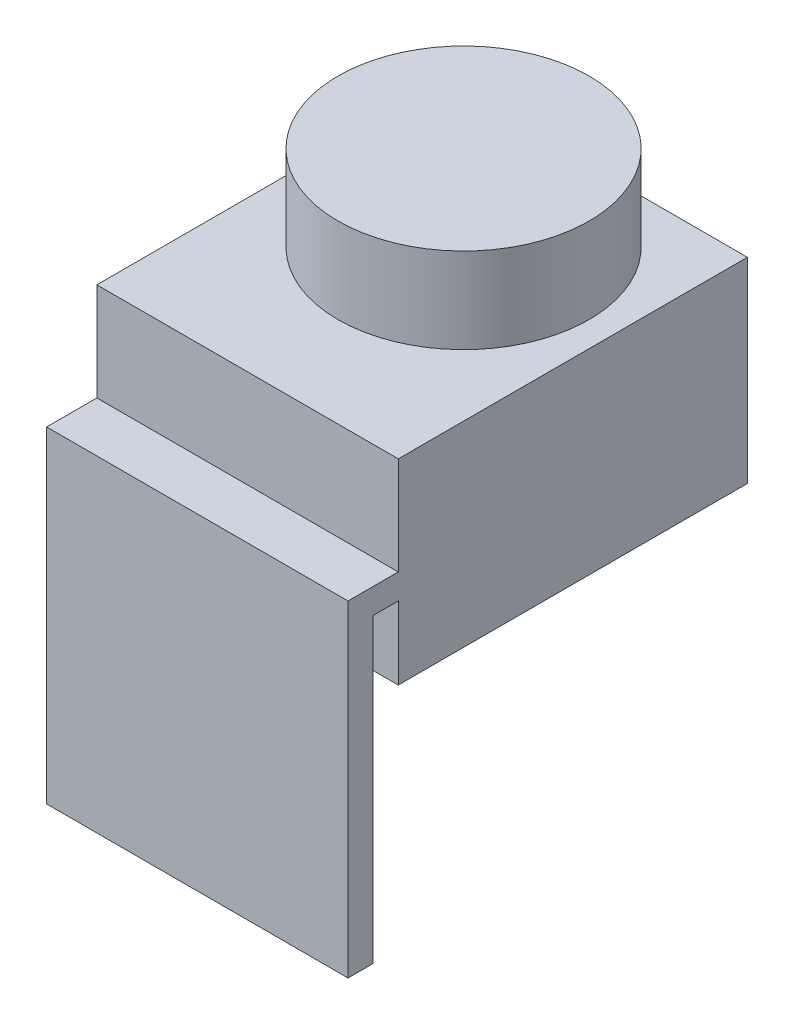
ISO-10303-21;
HEADER;
FILE_DESCRIPTION(('STEP AP214'),'2;1');
FILE_NAME('part.step','',(''),(''),'','','');
FILE_SCHEMA(('AUTOMOTIVE_DESIGN { 1 0 10303 214 1 1 1 1 }'));
ENDSEC;
DATA;
#1=APPLICATION_CONTEXT('core data for automotive mechanical design processes');
#2=APPLICATION_PROTOCOL_DEFINITION('international standard','automotive_design',2000,#1);
#3=PRODUCT_CONTEXT('',#1,'mechanical');
#4=PRODUCT('Part','Part','',(#3));
#5=PRODUCT_RELATED_PRODUCT_CATEGORY('part','',(#4));
#6=PRODUCT_DEFINITION_FORMATION('','',#4);
#7=PRODUCT_DEFINITION_CONTEXT('part definition',#1,'design');
#8=PRODUCT_DEFINITION('design','',#6,#7);
#9=PRODUCT_DEFINITION_SHAPE('','',#8);
#10=(LENGTH_UNIT() NAMED_UNIT(*) SI_UNIT(.MILLI.,.METRE.));
#11=(NAMED_UNIT(*) PLANE_ANGLE_UNIT() SI_UNIT($,.RADIAN.));
#12=(NAMED_UNIT(*) SI_UNIT($,.STERADIAN.) SOLID_ANGLE_UNIT());
#13=UNCERTAINTY_MEASURE_WITH_UNIT(LENGTH_MEASURE(1.E-05),#10,'distance_accuracy_value','');
#14=(GEOMETRIC_REPRESENTATION_CONTEXT(3) GLOBAL_UNCERTAINTY_ASSIGNED_CONTEXT((#13)) GLOBAL_UNIT_ASSIGNED_CONTEXT((#10,
#11,#12)) REPRESENTATION_CONTEXT('',''));
#15=CARTESIAN_POINT('',(0.,0.,0.));
#16=DIRECTION('',(0.,0.,1.));
#17=DIRECTION('',(1.,0.,0.));
#18=AXIS2_PLACEMENT_3D('',#15,#16,#17);
#19=CARTESIAN_POINT('',(-3.,-0.5,5.3));
#20=DIRECTION('',(0.,1.,0.));
#21=DIRECTION('',(0.,0.,1.));
#22=AXIS2_PLACEMENT_3D('',#19,#20,#21);
#23=PLANE('',#22);
#24=DIRECTION('',(1.,0.,0.));
#25=VECTOR('',#24,1.);
#26=CARTESIAN_POINT('',(-3.,-0.5,4.8));
#27=LINE('',#26,#25);
#28=CARTESIAN_POINT('',(-3.,-0.5,4.8));
#29=VERTEX_POINT('',#28);
#30=CARTESIAN_POINT('',(3.,-0.5,4.8));
#31=VERTEX_POINT('',#30);
#32=EDGE_CURVE('E129',#29,#31,#27,.T.);
#33=ORIENTED_EDGE('',*,*,#32,.F.);
#34=DIRECTION('',(0.,0.,-1.));
#35=VECTOR('',#34,1.);
#36=CARTESIAN_POINT('',(-3.,-0.5,5.3));
#37=LINE('',#36,#35);
#38=CARTESIAN_POINT('',(-3.,-0.5,4.3));
#39=VERTEX_POINT('',#38);
#40=EDGE_CURVE('E48',#29,#39,#37,.T.);
#41=ORIENTED_EDGE('',*,*,#40,.T.);
#42=DIRECTION('',(1.,0.,0.));
#43=VECTOR('',#42,1.);
#44=CARTESIAN_POINT('',(-3.,-0.5,4.3));
#45=LINE('',#44,#43);
#46=CARTESIAN_POINT('',(3.,-0.5,4.3));
#47=VERTEX_POINT('',#46);
#48=EDGE_CURVE('E133',#39,#47,#45,.T.);
#49=ORIENTED_EDGE('',*,*,#48,.T.);
#50=DIRECTION('',(0.,0.,-1.));
#51=VECTOR('',#50,1.);
#52=CARTESIAN_POINT('',(3.,-0.5,5.3));
#53=LINE('',#52,#51);
#54=EDGE_CURVE('E153',#31,#47,#53,.T.);
#55=ORIENTED_EDGE('',*,*,#54,.F.);
#56=EDGE_LOOP('',(#33,#41,#49,#55));
#57=FACE_BOUND('',#56,.T.);
#58=ADVANCED_FACE('F33',(#57),#23,.F.);
#59=CARTESIAN_POINT('',(-3.,1.95,4.3));
#60=DIRECTION('',(0.,0.,-1.));
#61=DIRECTION('',(-1.,0.,0.));
#62=AXIS2_PLACEMENT_3D('',#59,#60,#61);
#63=PLANE('',#62);
#64=DIRECTION('',(-1.,0.,0.));
#65=VECTOR('',#64,1.);
#66=CARTESIAN_POINT('',(-3.,0.,4.3));
#67=LINE('',#66,#65);
#68=CARTESIAN_POINT('',(3.,0.,4.3));
#69=VERTEX_POINT('',#68);
#70=CARTESIAN_POINT('',(-3.,0.,4.3));
#71=VERTEX_POINT('',#70);
#72=EDGE_CURVE('E135',#69,#71,#67,.T.);
#73=ORIENTED_EDGE('',*,*,#72,.F.);
#74=DIRECTION('',(0.,-1.,0.));
#75=VECTOR('',#74,1.);
#76=CARTESIAN_POINT('',(3.,1.95,4.3));
#77=LINE('',#76,#75);
#78=CARTESIAN_POINT('',(3.,1.95,4.3));
#79=VERTEX_POINT('',#78);
#80=EDGE_CURVE('E186',#79,#69,#77,.T.);
#81=ORIENTED_EDGE('',*,*,#80,.F.);
#82=DIRECTION('',(1.,0.,0.));
#83=VECTOR('',#82,1.);
#84=CARTESIAN_POINT('',(-3.,1.95,4.3));
#85=LINE('',#84,#83);
#86=CARTESIAN_POINT('',(-3.,1.95,4.3));
#87=VERTEX_POINT('',#86);
#88=EDGE_CURVE('E166',#87,#79,#85,.T.);
#89=ORIENTED_EDGE('',*,*,#88,.F.);
#90=DIRECTION('',(0.,-1.,0.));
#91=VECTOR('',#90,1.);
#92=CARTESIAN_POINT('',(-3.,1.95,4.3));
#93=LINE('',#92,#91);
#94=EDGE_CURVE('E11',#87,#71,#93,.T.);
#95=ORIENTED_EDGE('',*,*,#94,.T.);
#96=EDGE_LOOP('',(#73,#81,#89,#95));
#97=FACE_BOUND('',#96,.T.);
#98=ADVANCED_FACE('F211',(#97),#63,.F.);
#99=ORIENTED_EDGE('',*,*,#48,.F.);
#100=CARTESIAN_POINT('',(-3.,-1.95,4.3));
#101=VERTEX_POINT('',#100);
#102=EDGE_CURVE('E41',#39,#101,#93,.T.);
#103=ORIENTED_EDGE('',*,*,#102,.T.);
#104=DIRECTION('',(1.,0.,0.));
#105=VECTOR('',#104,1.);
#106=CARTESIAN_POINT('',(-3.,-1.95,4.3));
#107=LINE('',#106,#105);
#108=CARTESIAN_POINT('',(3.,-1.95,4.3));
#109=VERTEX_POINT('',#108);
#110=EDGE_CURVE('E175',#101,#109,#107,.T.);
#111=ORIENTED_EDGE('',*,*,#110,.T.);
#112=EDGE_CURVE('E185',#47,#109,#77,.T.);
#113=ORIENTED_EDGE('',*,*,#112,.F.);
#114=EDGE_LOOP('',(#99,#103,#111,#113));
#115=FACE_BOUND('',#114,.T.);
#116=ADVANCED_FACE('F199',(#115),#63,.F.);
#117=CARTESIAN_POINT('',(-3.,1.95,-2.65));
#118=DIRECTION('',(1.,0.,0.));
#119=DIRECTION('',(0.,0.,-1.));
#120=AXIS2_PLACEMENT_3D('',#117,#118,#119);
#121=PLANE('',#120);
#122=DIRECTION('',(0.,0.,1.));
#123=VECTOR('',#122,1.);
#124=CARTESIAN_POINT('',(-3.,-1.95,-2.65));
#125=LINE('',#124,#123);
#126=CARTESIAN_POINT('',(-3.,-1.95,-2.65));
#127=VERTEX_POINT('',#126);
#128=EDGE_CURVE('E160',#127,#101,#125,.T.);
#129=ORIENTED_EDGE('',*,*,#128,.T.);
#130=ORIENTED_EDGE('',*,*,#102,.F.);
#131=ORIENTED_EDGE('',*,*,#40,.F.);
#132=DIRECTION('',(0.,1.,0.));
#133=VECTOR('',#132,1.);
#134=CARTESIAN_POINT('',(-3.,-6.5,4.8));
#135=LINE('',#134,#133);
#136=CARTESIAN_POINT('',(-3.,-6.5,4.8));
#137=VERTEX_POINT('',#136);
#138=EDGE_CURVE('E113',#137,#29,#135,.T.);
#139=ORIENTED_EDGE('',*,*,#138,.F.);
#140=DIRECTION('',(0.,0.,-1.));
#141=VECTOR('',#140,1.);
#142=CARTESIAN_POINT('',(-3.,-6.5,5.3));
#143=LINE('',#142,#141);
#144=CARTESIAN_POINT('',(-3.,-6.5,5.3));
#145=VERTEX_POINT('',#144);
#146=EDGE_CURVE('E120',#145,#137,#143,.T.);
#147=ORIENTED_EDGE('',*,*,#146,.F.);
#148=DIRECTION('',(0.,-1.,0.));
#149=VECTOR('',#148,1.);
#150=CARTESIAN_POINT('',(-3.,0.,5.3));
#151=LINE('',#150,#149);
#152=CARTESIAN_POINT('',(-3.,0.,5.3));
#153=VERTEX_POINT('',#152);
#154=EDGE_CURVE('E140',#153,#145,#151,.T.);
#155=ORIENTED_EDGE('',*,*,#154,.F.);
#156=DIRECTION('',(0.,0.,-1.));
#157=VECTOR('',#156,1.);
#158=CARTESIAN_POINT('',(-3.,0.,5.3));
#159=LINE('',#158,#157);
#160=EDGE_CURVE('E145',#153,#71,#159,.T.);
#161=ORIENTED_EDGE('',*,*,#160,.T.);
#162=ORIENTED_EDGE('',*,*,#94,.F.);
#163=DIRECTION('',(0.,0.,1.));
#164=VECTOR('',#163,1.);
#165=CARTESIAN_POINT('',(-3.,1.95,-2.65));
#166=LINE('',#165,#164);
#167=CARTESIAN_POINT('',(-3.,1.95,-2.65));
#168=VERTEX_POINT('',#167);
#169=EDGE_CURVE('E163',#168,#87,#166,.T.);
#170=ORIENTED_EDGE('',*,*,#169,.F.);
#171=DIRECTION('',(0.,-1.,0.));
#172=VECTOR('',#171,1.);
#173=CARTESIAN_POINT('',(-3.,1.95,-2.65));
#174=LINE('',#173,#172);
#175=EDGE_CURVE('E173',#168,#127,#174,.T.);
#176=ORIENTED_EDGE('',*,*,#175,.T.);
#177=EDGE_LOOP('',(#129,#130,#131,#139,#147,#155,#161,#162,#170,#176));
#178=FACE_BOUND('',#177,.T.);
#179=ADVANCED_FACE('F35',(#178),#121,.F.);
#180=CARTESIAN_POINT('',(3.,1.95,-2.65));
#181=DIRECTION('',(-1.,0.,0.));
#182=DIRECTION('',(0.,0.,1.));
#183=AXIS2_PLACEMENT_3D('',#180,#181,#182);
#184=PLANE('',#183);
#185=DIRECTION('',(0.,0.,-1.));
#186=VECTOR('',#185,1.);
#187=CARTESIAN_POINT('',(3.,-1.95,-2.65));
#188=LINE('',#187,#186);
#189=CARTESIAN_POINT('',(3.,-1.95,-2.65));
#190=VERTEX_POINT('',#189);
#191=EDGE_CURVE('E178',#109,#190,#188,.T.);
#192=ORIENTED_EDGE('',*,*,#191,.T.);
#193=DIRECTION('',(0.,-1.,0.));
#194=VECTOR('',#193,1.);
#195=CARTESIAN_POINT('',(3.,1.95,-2.65));
#196=LINE('',#195,#194);
#197=CARTESIAN_POINT('',(3.,1.95,-2.65));
#198=VERTEX_POINT('',#197);
#199=EDGE_CURVE('E183',#198,#190,#196,.T.);
#200=ORIENTED_EDGE('',*,*,#199,.F.);
#201=DIRECTION('',(0.,0.,-1.));
#202=VECTOR('',#201,1.);
#203=CARTESIAN_POINT('',(3.,1.95,-2.65));
#204=LINE('',#203,#202);
#205=EDGE_CURVE('E169',#79,#198,#204,.T.);
#206=ORIENTED_EDGE('',*,*,#205,.F.);
#207=ORIENTED_EDGE('',*,*,#80,.T.);
#208=DIRECTION('',(0.,0.,-1.));
#209=VECTOR('',#208,1.);
#210=CARTESIAN_POINT('',(3.,0.,5.3));
#211=LINE('',#210,#209);
#212=CARTESIAN_POINT('',(3.,0.,5.3));
#213=VERTEX_POINT('',#212);
#214=EDGE_CURVE('E150',#213,#69,#211,.T.);
#215=ORIENTED_EDGE('',*,*,#214,.F.);
#216=DIRECTION('',(0.,1.,0.));
#217=VECTOR('',#216,1.);
#218=CARTESIAN_POINT('',(3.,0.,5.3));
#219=LINE('',#218,#217);
#220=CARTESIAN_POINT('',(3.,-6.5,5.3));
#221=VERTEX_POINT('',#220);
#222=EDGE_CURVE('E142',#221,#213,#219,.T.);
#223=ORIENTED_EDGE('',*,*,#222,.F.);
#224=DIRECTION('',(0.,0.,1.));
#225=VECTOR('',#224,1.);
#226=CARTESIAN_POINT('',(3.,-6.5,5.3));
#227=LINE('',#226,#225);
#228=CARTESIAN_POINT('',(3.,-6.5,4.8));
#229=VERTEX_POINT('',#228);
#230=EDGE_CURVE('E119',#229,#221,#227,.T.);
#231=ORIENTED_EDGE('',*,*,#230,.F.);
#232=DIRECTION('',(0.,1.,0.));
#233=VECTOR('',#232,1.);
#234=CARTESIAN_POINT('',(3.,-6.5,4.8));
#235=LINE('',#234,#233);
#236=EDGE_CURVE('E115',#229,#31,#235,.T.);
#237=ORIENTED_EDGE('',*,*,#236,.T.);
#238=ORIENTED_EDGE('',*,*,#54,.T.);
#239=ORIENTED_EDGE('',*,*,#112,.T.);
#240=EDGE_LOOP('',(#192,#200,#206,#207,#215,#223,#231,#237,#238,#239));
#241=FACE_BOUND('',#240,.T.);
#242=ADVANCED_FACE('F193',(#241),#184,.F.);
#243=CARTESIAN_POINT('',(-3.,1.95,-2.65));
#244=DIRECTION('',(0.,0.,1.));
#245=DIRECTION('',(1.,0.,0.));
#246=AXIS2_PLACEMENT_3D('',#243,#244,#245);
#247=PLANE('',#246);
#248=DIRECTION('',(-1.,0.,0.));
#249=VECTOR('',#248,1.);
#250=CARTESIAN_POINT('',(-3.,-1.95,-2.65));
#251=LINE('',#250,#249);
#252=EDGE_CURVE('E167',#190,#127,#251,.T.);
#253=ORIENTED_EDGE('',*,*,#252,.T.);
#254=ORIENTED_EDGE('',*,*,#175,.F.);
#255=DIRECTION('',(-1.,0.,0.));
#256=VECTOR('',#255,1.);
#257=CARTESIAN_POINT('',(-3.,1.95,-2.65));
#258=LINE('',#257,#256);
#259=EDGE_CURVE('E171',#198,#168,#258,.T.);
#260=ORIENTED_EDGE('',*,*,#259,.F.);
#261=ORIENTED_EDGE('',*,*,#199,.T.);
#262=EDGE_LOOP('',(#253,#254,#260,#261));
#263=FACE_BOUND('',#262,.T.);
#264=ADVANCED_FACE('F206',(#263),#247,.F.);
#265=CARTESIAN_POINT('',(0.,1.95,0.));
#266=DIRECTION('',(0.,1.,0.));
#267=DIRECTION('',(0.,0.,1.));
#268=AXIS2_PLACEMENT_3D('',#265,#266,#267);
#269=PLANE('',#268);
#270=CARTESIAN_POINT('',(0.,1.95,0.));
#271=DIRECTION('',(0.,1.,0.));
#272=DIRECTION('',(0.,0.,1.));
#273=AXIS2_PLACEMENT_3D('',#270,#271,#272);
#274=CIRCLE('',#273,2.5);
#275=CARTESIAN_POINT('',(0.,1.95,2.5));
#276=VERTEX_POINT('',#275);
#277=EDGE_CURVE('E156',#276,#276,#274,.T.);
#278=ORIENTED_EDGE('',*,*,#277,.F.);
#279=EDGE_LOOP('',(#278));
#280=FACE_BOUND('',#279,.T.);
#281=ORIENTED_EDGE('',*,*,#169,.T.);
#282=ORIENTED_EDGE('',*,*,#88,.T.);
#283=ORIENTED_EDGE('',*,*,#205,.T.);
#284=ORIENTED_EDGE('',*,*,#259,.T.);
#285=EDGE_LOOP('',(#281,#282,#283,#284));
#286=FACE_BOUND('',#285,.T.);
#287=ADVANCED_FACE('F210',(#280,#286),#269,.T.);
#288=CARTESIAN_POINT('',(0.,-1.95,0.));
#289=DIRECTION('',(0.,1.,0.));
#290=DIRECTION('',(0.,0.,1.));
#291=AXIS2_PLACEMENT_3D('',#288,#289,#290);
#292=PLANE('',#291);
#293=ORIENTED_EDGE('',*,*,#128,.F.);
#294=ORIENTED_EDGE('',*,*,#252,.F.);
#295=ORIENTED_EDGE('',*,*,#191,.F.);
#296=ORIENTED_EDGE('',*,*,#110,.F.);
#297=EDGE_LOOP('',(#293,#294,#295,#296));
#298=FACE_BOUND('',#297,.T.);
#299=ADVANCED_FACE('F203',(#298),#292,.F.);
#300=CARTESIAN_POINT('',(0.,3.65,0.));
#301=DIRECTION('',(0.,-1.,0.));
#302=DIRECTION('',(0.,0.,-1.));
#303=AXIS2_PLACEMENT_3D('',#300,#301,#302);
#304=CYLINDRICAL_SURFACE('',#303,2.5);
#305=CARTESIAN_POINT('',(0.,3.65,0.));
#306=DIRECTION('',(0.,1.,0.));
#307=DIRECTION('',(0.,0.,1.));
#308=AXIS2_PLACEMENT_3D('',#305,#306,#307);
#309=CIRCLE('',#308,2.5);
#310=CARTESIAN_POINT('',(0.,3.65,2.5));
#311=VERTEX_POINT('',#310);
#312=EDGE_CURVE('E157',#311,#311,#309,.T.);
#313=ORIENTED_EDGE('',*,*,#312,.F.);
#314=EDGE_LOOP('',(#313));
#315=FACE_BOUND('',#314,.T.);
#316=ORIENTED_EDGE('',*,*,#277,.T.);
#317=EDGE_LOOP('',(#316));
#318=FACE_BOUND('',#317,.T.);
#319=ADVANCED_FACE('F231',(#315,#318),#304,.T.);
#320=CARTESIAN_POINT('',(0.,3.65,0.));
#321=DIRECTION('',(0.,1.,0.));
#322=DIRECTION('',(0.,0.,1.));
#323=AXIS2_PLACEMENT_3D('',#320,#321,#322);
#324=PLANE('',#323);
#325=ORIENTED_EDGE('',*,*,#312,.T.);
#326=EDGE_LOOP('',(#325));
#327=FACE_BOUND('',#326,.T.);
#328=ADVANCED_FACE('F228',(#327),#324,.T.);
#329=CARTESIAN_POINT('',(-3.,0.,5.3));
#330=DIRECTION('',(0.,-1.,0.));
#331=DIRECTION('',(0.,0.,-1.));
#332=AXIS2_PLACEMENT_3D('',#329,#330,#331);
#333=PLANE('',#332);
#334=ORIENTED_EDGE('',*,*,#72,.T.);
#335=ORIENTED_EDGE('',*,*,#160,.F.);
#336=DIRECTION('',(-1.,0.,0.));
#337=VECTOR('',#336,1.);
#338=CARTESIAN_POINT('',(-3.,0.,5.3));
#339=LINE('',#338,#337);
#340=EDGE_CURVE('E144',#213,#153,#339,.T.);
#341=ORIENTED_EDGE('',*,*,#340,.F.);
#342=ORIENTED_EDGE('',*,*,#214,.T.);
#343=EDGE_LOOP('',(#334,#335,#341,#342));
#344=FACE_BOUND('',#343,.T.);
#345=ADVANCED_FACE('F214',(#344),#333,.F.);
#346=CARTESIAN_POINT('',(0.,0.,5.3));
#347=DIRECTION('',(0.,0.,1.));
#348=DIRECTION('',(1.,0.,0.));
#349=AXIS2_PLACEMENT_3D('',#346,#347,#348);
#350=PLANE('',#349);
#351=ORIENTED_EDGE('',*,*,#154,.T.);
#352=DIRECTION('',(-1.,0.,0.));
#353=VECTOR('',#352,1.);
#354=CARTESIAN_POINT('',(-3.,-6.5,5.3));
#355=LINE('',#354,#353);
#356=EDGE_CURVE('E126',#221,#145,#355,.T.);
#357=ORIENTED_EDGE('',*,*,#356,.F.);
#358=ORIENTED_EDGE('',*,*,#222,.T.);
#359=ORIENTED_EDGE('',*,*,#340,.T.);
#360=EDGE_LOOP('',(#351,#357,#358,#359));
#361=FACE_BOUND('',#360,.T.);
#362=ADVANCED_FACE('F217',(#361),#350,.T.);
#363=CARTESIAN_POINT('',(-3.,-6.5,4.8));
#364=DIRECTION('',(0.,0.,1.));
#365=DIRECTION('',(1.,0.,0.));
#366=AXIS2_PLACEMENT_3D('',#363,#364,#365);
#367=PLANE('',#366);
#368=ORIENTED_EDGE('',*,*,#32,.T.);
#369=ORIENTED_EDGE('',*,*,#236,.F.);
#370=DIRECTION('',(1.,0.,0.));
#371=VECTOR('',#370,1.);
#372=CARTESIAN_POINT('',(-3.,-6.5,4.8));
#373=LINE('',#372,#371);
#374=EDGE_CURVE('E109',#137,#229,#373,.T.);
#375=ORIENTED_EDGE('',*,*,#374,.F.);
#376=ORIENTED_EDGE('',*,*,#138,.T.);
#377=EDGE_LOOP('',(#368,#369,#375,#376));
#378=FACE_BOUND('',#377,.T.);
#379=ADVANCED_FACE('F111',(#378),#367,.F.);
#380=CARTESIAN_POINT('',(0.,-6.5,0.));
#381=DIRECTION('',(0.,-1.,0.));
#382=DIRECTION('',(0.,0.,-1.));
#383=AXIS2_PLACEMENT_3D('',#380,#381,#382);
#384=PLANE('',#383);
#385=ORIENTED_EDGE('',*,*,#146,.T.);
#386=ORIENTED_EDGE('',*,*,#374,.T.);
#387=ORIENTED_EDGE('',*,*,#230,.T.);
#388=ORIENTED_EDGE('',*,*,#356,.T.);
#389=EDGE_LOOP('',(#385,#386,#387,#388));
#390=FACE_BOUND('',#389,.T.);
#391=ADVANCED_FACE('F124',(#390),#384,.T.);
#392=CLOSED_SHELL('',(#58,#98,#116,#179,#242,#264,#287,#299,#319,#328,#345,#362,#379,#391));
#393=MANIFOLD_SOLID_BREP('B2',#392);
#394=ADVANCED_BREP_SHAPE_REPRESENTATION('',(#18,#393),#14);
#395=SHAPE_DEFINITION_REPRESENTATION(#9,#394);
ENDSEC;
END-ISO-10303-21;
